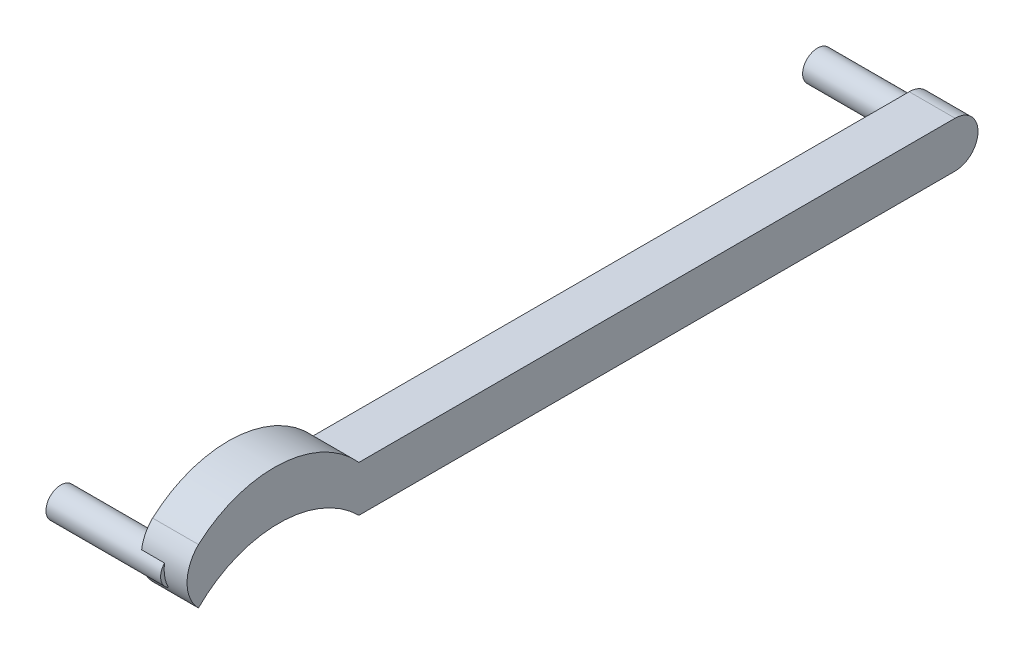
ISO-10303-21;
HEADER;
FILE_DESCRIPTION(('STEP AP214'),'2;1');
FILE_NAME('part.step','',(''),(''),'','','');
FILE_SCHEMA(('AUTOMOTIVE_DESIGN { 1 0 10303 214 1 1 1 1 }'));
ENDSEC;
DATA;
#1=APPLICATION_CONTEXT('core data for automotive mechanical design processes');
#2=APPLICATION_PROTOCOL_DEFINITION('international standard','automotive_design',2000,#1);
#3=PRODUCT_CONTEXT('',#1,'mechanical');
#4=PRODUCT('Part','Part','',(#3));
#5=PRODUCT_RELATED_PRODUCT_CATEGORY('part','',(#4));
#6=PRODUCT_DEFINITION_FORMATION('','',#4);
#7=PRODUCT_DEFINITION_CONTEXT('part definition',#1,'design');
#8=PRODUCT_DEFINITION('design','',#6,#7);
#9=PRODUCT_DEFINITION_SHAPE('','',#8);
#10=(LENGTH_UNIT() NAMED_UNIT(*) SI_UNIT(.MILLI.,.METRE.));
#11=(NAMED_UNIT(*) PLANE_ANGLE_UNIT() SI_UNIT($,.RADIAN.));
#12=(NAMED_UNIT(*) SI_UNIT($,.STERADIAN.) SOLID_ANGLE_UNIT());
#13=UNCERTAINTY_MEASURE_WITH_UNIT(LENGTH_MEASURE(1.E-05),#10,'distance_accuracy_value','');
#14=(GEOMETRIC_REPRESENTATION_CONTEXT(3) GLOBAL_UNCERTAINTY_ASSIGNED_CONTEXT((#13)) GLOBAL_UNIT_ASSIGNED_CONTEXT((#10,
#11,#12)) REPRESENTATION_CONTEXT('',''));
#15=CARTESIAN_POINT('',(0.,0.,0.));
#16=DIRECTION('',(0.,0.,1.));
#17=DIRECTION('',(1.,0.,0.));
#18=AXIS2_PLACEMENT_3D('',#15,#16,#17);
#19=CARTESIAN_POINT('',(1.,-2.30119587306183,13.1988041269382));
#20=DIRECTION('',(-1.,0.,0.));
#21=DIRECTION('',(0.,0.,1.));
#22=AXIS2_PLACEMENT_3D('',#19,#20,#21);
#23=CYLINDRICAL_SURFACE('',#22,4.95772590627754);
#24=CARTESIAN_POINT('',(-1.,-2.30119587306183,13.1988041269382));
#25=DIRECTION('',(1.,0.,0.));
#26=DIRECTION('',(0.,0.,-1.));
#27=AXIS2_PLACEMENT_3D('',#24,#25,#26);
#28=CIRCLE('',#27,4.95772590627754);
#29=CARTESIAN_POINT('',(-1.,0.999999999999999,9.5));
#30=VERTEX_POINT('',#29);
#31=CARTESIAN_POINT('',(-1.,1.39760825387638,16.5));
#32=VERTEX_POINT('',#31);
#33=EDGE_CURVE('E134',#30,#32,#28,.T.);
#34=ORIENTED_EDGE('',*,*,#33,.T.);
#35=DIRECTION('',(-1.,0.,0.));
#36=VECTOR('',#35,1.);
#37=CARTESIAN_POINT('',(1.,1.39760825387638,16.5));
#38=LINE('',#37,#36);
#39=CARTESIAN_POINT('',(1.,1.39760825387638,16.5));
#40=VERTEX_POINT('',#39);
#41=EDGE_CURVE('E154',#40,#32,#38,.T.);
#42=ORIENTED_EDGE('',*,*,#41,.F.);
#43=CARTESIAN_POINT('',(1.,-2.30119587306183,13.1988041269382));
#44=DIRECTION('',(1.,0.,0.));
#45=DIRECTION('',(0.,0.,-1.));
#46=AXIS2_PLACEMENT_3D('',#43,#44,#45);
#47=CIRCLE('',#46,4.95772590627754);
#48=CARTESIAN_POINT('',(1.,0.999999999999999,9.5));
#49=VERTEX_POINT('',#48);
#50=EDGE_CURVE('E147',#49,#40,#47,.T.);
#51=ORIENTED_EDGE('',*,*,#50,.F.);
#52=DIRECTION('',(-1.,0.,0.));
#53=VECTOR('',#52,1.);
#54=CARTESIAN_POINT('',(1.,0.999999999999999,9.5));
#55=LINE('',#54,#53);
#56=EDGE_CURVE('E130',#49,#30,#55,.T.);
#57=ORIENTED_EDGE('',*,*,#56,.T.);
#58=EDGE_LOOP('',(#34,#42,#51,#57));
#59=FACE_BOUND('',#58,.T.);
#60=ADVANCED_FACE('F37',(#59),#23,.T.);
#61=CARTESIAN_POINT('',(1.,0.198804126938183,15.3011958730618));
#62=DIRECTION('',(-1.,0.,0.));
#63=DIRECTION('',(0.,0.,1.));
#64=AXIS2_PLACEMENT_3D('',#61,#62,#63);
#65=CYLINDRICAL_SURFACE('',#64,1.69536505494484);
#66=CARTESIAN_POINT('',(-1.,0.198804126938183,15.3011958730618));
#67=DIRECTION('',(1.,0.,0.));
#68=DIRECTION('',(0.,0.,-1.));
#69=AXIS2_PLACEMENT_3D('',#66,#67,#68);
#70=CIRCLE('',#69,1.69536505494484);
#71=CARTESIAN_POINT('',(-1.,0.438861801075862,16.9794792170224));
#72=VERTEX_POINT('',#71);
#73=EDGE_CURVE('E138',#32,#72,#70,.T.);
#74=ORIENTED_EDGE('',*,*,#73,.T.);
#75=DIRECTION('',(1.,0.,0.));
#76=VECTOR('',#75,1.);
#77=CARTESIAN_POINT('',(-2.5,0.438861801075862,16.9794792170224));
#78=LINE('',#77,#76);
#79=CARTESIAN_POINT('',(0.,0.438861801075862,16.9794792170224));
#80=VERTEX_POINT('',#79);
#81=EDGE_CURVE('E52',#72,#80,#78,.T.);
#82=ORIENTED_EDGE('',*,*,#81,.T.);
#83=CARTESIAN_POINT('',(0.,0.198804126938183,15.3011958730618));
#84=DIRECTION('',(1.,0.,0.));
#85=DIRECTION('',(0.,0.,-1.));
#86=AXIS2_PLACEMENT_3D('',#83,#84,#85);
#87=CIRCLE('',#86,1.69536505494484);
#88=CARTESIAN_POINT('',(0.,-0.570142040397499,16.8121506908071));
#89=VERTEX_POINT('',#88);
#90=EDGE_CURVE('E11',#80,#89,#87,.T.);
#91=ORIENTED_EDGE('',*,*,#90,.T.);
#92=DIRECTION('',(1.,0.,0.));
#93=VECTOR('',#92,1.);
#94=CARTESIAN_POINT('',(-2.5,-0.570142040397499,16.8121506908071));
#95=LINE('',#94,#93);
#96=CARTESIAN_POINT('',(-1.,-0.570142040397499,16.8121506908071));
#97=VERTEX_POINT('',#96);
#98=EDGE_CURVE('E173',#89,#97,#95,.F.);
#99=ORIENTED_EDGE('',*,*,#98,.T.);
#100=CARTESIAN_POINT('',(-1.,-1.00000000000002,16.5));
#101=VERTEX_POINT('',#100);
#102=EDGE_CURVE('E137',#97,#101,#70,.T.);
#103=ORIENTED_EDGE('',*,*,#102,.T.);
#104=DIRECTION('',(-1.,0.,0.));
#105=VECTOR('',#104,1.);
#106=CARTESIAN_POINT('',(1.,-1.00000000000002,16.5));
#107=LINE('',#106,#105);
#108=CARTESIAN_POINT('',(1.,-1.00000000000002,16.5));
#109=VERTEX_POINT('',#108);
#110=EDGE_CURVE('E151',#109,#101,#107,.T.);
#111=ORIENTED_EDGE('',*,*,#110,.F.);
#112=CARTESIAN_POINT('',(1.,0.198804126938183,15.3011958730618));
#113=DIRECTION('',(1.,0.,0.));
#114=DIRECTION('',(0.,0.,-1.));
#115=AXIS2_PLACEMENT_3D('',#112,#113,#114);
#116=CIRCLE('',#115,1.69536505494484);
#117=EDGE_CURVE('E97',#40,#109,#116,.T.);
#118=ORIENTED_EDGE('',*,*,#117,.F.);
#119=ORIENTED_EDGE('',*,*,#41,.T.);
#120=EDGE_LOOP('',(#74,#82,#91,#99,#103,#111,#118,#119));
#121=FACE_BOUND('',#120,.T.);
#122=ADVANCED_FACE('F163',(#121),#65,.T.);
#123=CARTESIAN_POINT('',(1.,-4.50000000000002,13.));
#124=DIRECTION('',(-1.,0.,0.));
#125=DIRECTION('',(0.,0.,1.));
#126=AXIS2_PLACEMENT_3D('',#123,#124,#125);
#127=CYLINDRICAL_SURFACE('',#126,4.94974746830584);
#128=CARTESIAN_POINT('',(-1.,-4.50000000000002,13.));
#129=DIRECTION('',(-1.,0.,0.));
#130=DIRECTION('',(0.,0.,-1.));
#131=AXIS2_PLACEMENT_3D('',#128,#129,#130);
#132=CIRCLE('',#131,4.94974746830584);
#133=CARTESIAN_POINT('',(-1.,-1.00000000000001,9.5));
#134=VERTEX_POINT('',#133);
#135=EDGE_CURVE('E141',#101,#134,#132,.T.);
#136=ORIENTED_EDGE('',*,*,#135,.T.);
#137=DIRECTION('',(-1.,0.,0.));
#138=VECTOR('',#137,1.);
#139=CARTESIAN_POINT('',(1.,-1.00000000000001,9.5));
#140=LINE('',#139,#138);
#141=CARTESIAN_POINT('',(1.,-1.00000000000001,9.5));
#142=VERTEX_POINT('',#141);
#143=EDGE_CURVE('E125',#142,#134,#140,.T.);
#144=ORIENTED_EDGE('',*,*,#143,.F.);
#145=CARTESIAN_POINT('',(1.,-4.50000000000002,13.));
#146=DIRECTION('',(-1.,0.,0.));
#147=DIRECTION('',(0.,0.,-1.));
#148=AXIS2_PLACEMENT_3D('',#145,#146,#147);
#149=CIRCLE('',#148,4.94974746830584);
#150=EDGE_CURVE('E113',#109,#142,#149,.T.);
#151=ORIENTED_EDGE('',*,*,#150,.F.);
#152=ORIENTED_EDGE('',*,*,#110,.T.);
#153=EDGE_LOOP('',(#136,#144,#151,#152));
#154=FACE_BOUND('',#153,.T.);
#155=ADVANCED_FACE('F208',(#154),#127,.F.);
#156=CARTESIAN_POINT('',(1.,-1.,-16.5));
#157=DIRECTION('',(0.,1.,0.));
#158=DIRECTION('',(0.,0.,1.));
#159=AXIS2_PLACEMENT_3D('',#156,#157,#158);
#160=PLANE('',#159);
#161=DIRECTION('',(0.,0.,-1.));
#162=VECTOR('',#161,1.);
#163=CARTESIAN_POINT('',(-1.,-1.,-16.5));
#164=LINE('',#163,#162);
#165=CARTESIAN_POINT('',(-1.,-1.,-16.5));
#166=VERTEX_POINT('',#165);
#167=EDGE_CURVE('E122',#134,#166,#164,.T.);
#168=ORIENTED_EDGE('',*,*,#167,.T.);
#169=DIRECTION('',(-1.,0.,0.));
#170=VECTOR('',#169,1.);
#171=CARTESIAN_POINT('',(1.,-1.,-16.5));
#172=LINE('',#171,#170);
#173=CARTESIAN_POINT('',(1.,-1.,-16.5));
#174=VERTEX_POINT('',#173);
#175=EDGE_CURVE('E119',#174,#166,#172,.T.);
#176=ORIENTED_EDGE('',*,*,#175,.F.);
#177=DIRECTION('',(0.,0.,-1.));
#178=VECTOR('',#177,1.);
#179=CARTESIAN_POINT('',(1.,-1.,-16.5));
#180=LINE('',#179,#178);
#181=EDGE_CURVE('E106',#142,#174,#180,.T.);
#182=ORIENTED_EDGE('',*,*,#181,.F.);
#183=ORIENTED_EDGE('',*,*,#143,.T.);
#184=EDGE_LOOP('',(#168,#176,#182,#183));
#185=FACE_BOUND('',#184,.T.);
#186=ADVANCED_FACE('F120',(#185),#160,.F.);
#187=CARTESIAN_POINT('',(1.,0.,-16.5));
#188=DIRECTION('',(-1.,0.,0.));
#189=DIRECTION('',(0.,0.,1.));
#190=AXIS2_PLACEMENT_3D('',#187,#188,#189);
#191=CYLINDRICAL_SURFACE('',#190,1.);
#192=CARTESIAN_POINT('',(-1.,0.,-16.5));
#193=DIRECTION('',(1.,0.,0.));
#194=DIRECTION('',(0.,0.,-1.));
#195=AXIS2_PLACEMENT_3D('',#192,#193,#194);
#196=CIRCLE('',#195,1.);
#197=CARTESIAN_POINT('',(-1.,1.,-16.5));
#198=VERTEX_POINT('',#197);
#199=EDGE_CURVE('E144',#166,#198,#196,.T.);
#200=ORIENTED_EDGE('',*,*,#199,.T.);
#201=DIRECTION('',(-1.,0.,0.));
#202=VECTOR('',#201,1.);
#203=CARTESIAN_POINT('',(1.,1.,-16.5));
#204=LINE('',#203,#202);
#205=CARTESIAN_POINT('',(1.,1.,-16.5));
#206=VERTEX_POINT('',#205);
#207=EDGE_CURVE('E126',#206,#198,#204,.T.);
#208=ORIENTED_EDGE('',*,*,#207,.F.);
#209=CARTESIAN_POINT('',(1.,0.,-16.5));
#210=DIRECTION('',(1.,0.,0.));
#211=DIRECTION('',(0.,0.,-1.));
#212=AXIS2_PLACEMENT_3D('',#209,#210,#211);
#213=CIRCLE('',#212,1.);
#214=EDGE_CURVE('E110',#174,#206,#213,.T.);
#215=ORIENTED_EDGE('',*,*,#214,.F.);
#216=ORIENTED_EDGE('',*,*,#175,.T.);
#217=EDGE_LOOP('',(#200,#208,#215,#216));
#218=FACE_BOUND('',#217,.T.);
#219=ADVANCED_FACE('F128',(#218),#191,.T.);
#220=CARTESIAN_POINT('',(1.,1.,-16.5));
#221=DIRECTION('',(0.,-1.,0.));
#222=DIRECTION('',(0.,0.,-1.));
#223=AXIS2_PLACEMENT_3D('',#220,#221,#222);
#224=PLANE('',#223);
#225=DIRECTION('',(0.,0.,1.));
#226=VECTOR('',#225,1.);
#227=CARTESIAN_POINT('',(-1.,1.,-16.5));
#228=LINE('',#227,#226);
#229=EDGE_CURVE('E88',#198,#30,#228,.T.);
#230=ORIENTED_EDGE('',*,*,#229,.T.);
#231=ORIENTED_EDGE('',*,*,#56,.F.);
#232=DIRECTION('',(0.,0.,1.));
#233=VECTOR('',#232,1.);
#234=CARTESIAN_POINT('',(1.,1.,-16.5));
#235=LINE('',#234,#233);
#236=EDGE_CURVE('E61',#206,#49,#235,.T.);
#237=ORIENTED_EDGE('',*,*,#236,.F.);
#238=ORIENTED_EDGE('',*,*,#207,.T.);
#239=EDGE_LOOP('',(#230,#231,#237,#238));
#240=FACE_BOUND('',#239,.T.);
#241=ADVANCED_FACE('F168',(#240),#224,.F.);
#242=CARTESIAN_POINT('',(1.,-2.30119587306183,13.1988041269382));
#243=DIRECTION('',(1.,0.,0.));
#244=DIRECTION('',(0.,0.,-1.));
#245=AXIS2_PLACEMENT_3D('',#242,#243,#244);
#246=PLANE('',#245);
#247=ORIENTED_EDGE('',*,*,#50,.T.);
#248=ORIENTED_EDGE('',*,*,#117,.T.);
#249=ORIENTED_EDGE('',*,*,#150,.T.);
#250=ORIENTED_EDGE('',*,*,#181,.T.);
#251=ORIENTED_EDGE('',*,*,#214,.T.);
#252=ORIENTED_EDGE('',*,*,#236,.T.);
#253=EDGE_LOOP('',(#247,#248,#249,#250,#251,#252));
#254=FACE_BOUND('',#253,.T.);
#255=ADVANCED_FACE('F108',(#254),#246,.T.);
#256=CARTESIAN_POINT('',(-1.,-2.30119587306183,13.1988041269382));
#257=DIRECTION('',(1.,0.,0.));
#258=DIRECTION('',(0.,0.,-1.));
#259=AXIS2_PLACEMENT_3D('',#256,#257,#258);
#260=PLANE('',#259);
#261=CARTESIAN_POINT('',(-1.,0.,-16.5));
#262=DIRECTION('',(1.,0.,0.));
#263=DIRECTION('',(0.,0.,-1.));
#264=AXIS2_PLACEMENT_3D('',#261,#262,#263);
#265=CIRCLE('',#264,0.650000000000001);
#266=CARTESIAN_POINT('',(-1.,0.,-17.15));
#267=VERTEX_POINT('',#266);
#268=EDGE_CURVE('E40',#267,#267,#265,.T.);
#269=ORIENTED_EDGE('',*,*,#268,.T.);
#270=EDGE_LOOP('',(#269));
#271=FACE_BOUND('',#270,.T.);
#272=ORIENTED_EDGE('',*,*,#102,.F.);
#273=CARTESIAN_POINT('',(-1.,0.,16.5));
#274=DIRECTION('',(1.,0.,0.));
#275=DIRECTION('',(0.,0.,-1.));
#276=AXIS2_PLACEMENT_3D('',#273,#274,#275);
#277=CIRCLE('',#276,0.650000000000001);
#278=EDGE_CURVE('E45',#97,#72,#277,.T.);
#279=ORIENTED_EDGE('',*,*,#278,.T.);
#280=ORIENTED_EDGE('',*,*,#73,.F.);
#281=ORIENTED_EDGE('',*,*,#33,.F.);
#282=ORIENTED_EDGE('',*,*,#229,.F.);
#283=ORIENTED_EDGE('',*,*,#199,.F.);
#284=ORIENTED_EDGE('',*,*,#167,.F.);
#285=ORIENTED_EDGE('',*,*,#135,.F.);
#286=EDGE_LOOP('',(#272,#279,#280,#281,#282,#283,#284,#285));
#287=FACE_BOUND('',#286,.T.);
#288=ADVANCED_FACE('F158',(#271,#287),#260,.F.);
#289=CARTESIAN_POINT('',(-5.,0.,16.5));
#290=DIRECTION('',(1.,0.,0.));
#291=DIRECTION('',(0.,0.,-1.));
#292=AXIS2_PLACEMENT_3D('',#289,#290,#291);
#293=CYLINDRICAL_SURFACE('',#292,0.650000000000001);
#294=CARTESIAN_POINT('',(-5.,0.,16.5));
#295=DIRECTION('',(1.,0.,0.));
#296=DIRECTION('',(0.,0.,-1.));
#297=AXIS2_PLACEMENT_3D('',#294,#295,#296);
#298=CIRCLE('',#297,0.650000000000001);
#299=CARTESIAN_POINT('',(-5.,0.,15.85));
#300=VERTEX_POINT('',#299);
#301=EDGE_CURVE('E175',#300,#300,#298,.T.);
#302=ORIENTED_EDGE('',*,*,#301,.T.);
#303=EDGE_LOOP('',(#302));
#304=FACE_BOUND('',#303,.T.);
#305=ORIENTED_EDGE('',*,*,#81,.F.);
#306=ORIENTED_EDGE('',*,*,#278,.F.);
#307=ORIENTED_EDGE('',*,*,#98,.F.);
#308=CARTESIAN_POINT('',(0.,0.,16.5));
#309=DIRECTION('',(1.,0.,0.));
#310=DIRECTION('',(0.,0.,-1.));
#311=AXIS2_PLACEMENT_3D('',#308,#309,#310);
#312=CIRCLE('',#311,0.650000000000001);
#313=EDGE_CURVE('E176',#80,#89,#312,.T.);
#314=ORIENTED_EDGE('',*,*,#313,.F.);
#315=EDGE_LOOP('',(#305,#306,#307,#314));
#316=FACE_BOUND('',#315,.T.);
#317=ADVANCED_FACE('F223',(#304,#316),#293,.T.);
#318=CARTESIAN_POINT('',(-5.,0.,16.5));
#319=DIRECTION('',(1.,0.,0.));
#320=DIRECTION('',(0.,0.,-1.));
#321=AXIS2_PLACEMENT_3D('',#318,#319,#320);
#322=PLANE('',#321);
#323=ORIENTED_EDGE('',*,*,#301,.F.);
#324=EDGE_LOOP('',(#323));
#325=FACE_BOUND('',#324,.T.);
#326=ADVANCED_FACE('F200',(#325),#322,.F.);
#327=CARTESIAN_POINT('',(0.,0.,16.5));
#328=DIRECTION('',(1.,0.,0.));
#329=DIRECTION('',(0.,0.,-1.));
#330=AXIS2_PLACEMENT_3D('',#327,#328,#329);
#331=PLANE('',#330);
#332=ORIENTED_EDGE('',*,*,#90,.F.);
#333=ORIENTED_EDGE('',*,*,#313,.T.);
#334=EDGE_LOOP('',(#332,#333));
#335=FACE_BOUND('',#334,.T.);
#336=ADVANCED_FACE('F192',(#335),#331,.T.);
#337=CARTESIAN_POINT('',(-5.,0.,-16.5));
#338=DIRECTION('',(1.,0.,0.));
#339=DIRECTION('',(0.,0.,-1.));
#340=AXIS2_PLACEMENT_3D('',#337,#338,#339);
#341=CYLINDRICAL_SURFACE('',#340,0.650000000000001);
#342=CARTESIAN_POINT('',(-5.,0.,-16.5));
#343=DIRECTION('',(1.,0.,0.));
#344=DIRECTION('',(0.,0.,-1.));
#345=AXIS2_PLACEMENT_3D('',#342,#343,#344);
#346=CIRCLE('',#345,0.650000000000001);
#347=CARTESIAN_POINT('',(-5.,0.,-17.15));
#348=VERTEX_POINT('',#347);
#349=EDGE_CURVE('E181',#348,#348,#346,.T.);
#350=ORIENTED_EDGE('',*,*,#349,.T.);
#351=EDGE_LOOP('',(#350));
#352=FACE_BOUND('',#351,.T.);
#353=ORIENTED_EDGE('',*,*,#268,.F.);
#354=EDGE_LOOP('',(#353));
#355=FACE_BOUND('',#354,.T.);
#356=ADVANCED_FACE('F189',(#352,#355),#341,.T.);
#357=CARTESIAN_POINT('',(-5.,0.,-16.5));
#358=DIRECTION('',(1.,0.,0.));
#359=DIRECTION('',(0.,0.,-1.));
#360=AXIS2_PLACEMENT_3D('',#357,#358,#359);
#361=PLANE('',#360);
#362=ORIENTED_EDGE('',*,*,#349,.F.);
#363=EDGE_LOOP('',(#362));
#364=FACE_BOUND('',#363,.T.);
#365=ADVANCED_FACE('F191',(#364),#361,.F.);
#366=CLOSED_SHELL('',(#60,#122,#155,#186,#219,#241,#255,#288,#317,#326,#336,#356,#365));
#367=MANIFOLD_SOLID_BREP('B2',#366);
#368=ADVANCED_BREP_SHAPE_REPRESENTATION('',(#18,#367),#14);
#369=SHAPE_DEFINITION_REPRESENTATION(#9,#368);
ENDSEC;
END-ISO-10303-21;
